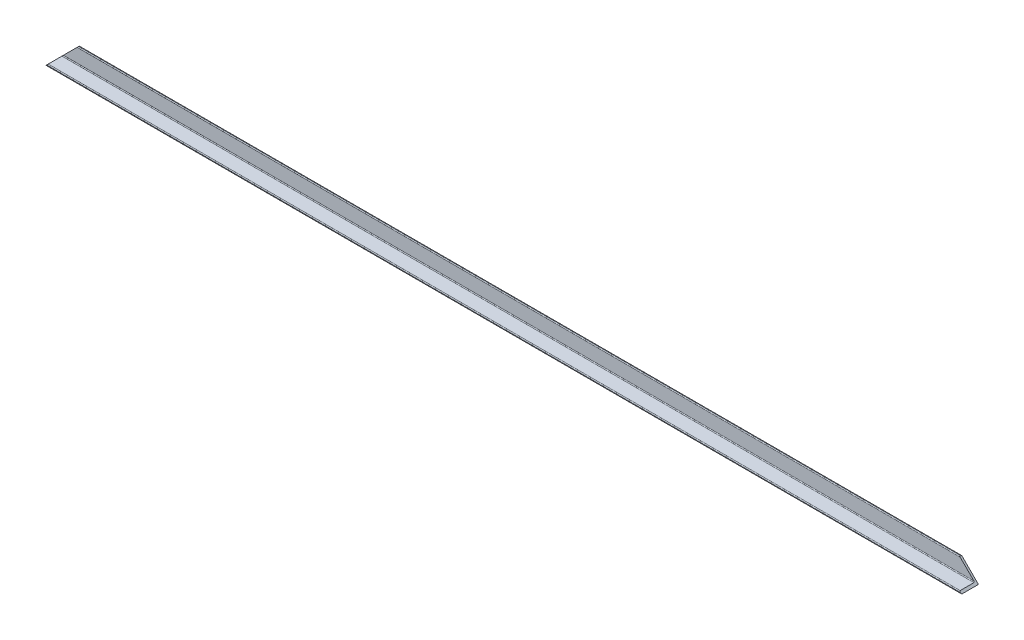
ISO-10303-21;
HEADER;
FILE_DESCRIPTION(('STEP AP214'),'2;1');
FILE_NAME('part.step','',(''),(''),'','','');
FILE_SCHEMA(('AUTOMOTIVE_DESIGN { 1 0 10303 214 1 1 1 1 }'));
ENDSEC;
DATA;
#1=APPLICATION_CONTEXT('core data for automotive mechanical design processes');
#2=APPLICATION_PROTOCOL_DEFINITION('international standard','automotive_design',2000,#1);
#3=PRODUCT_CONTEXT('',#1,'mechanical');
#4=PRODUCT('Part','Part','',(#3));
#5=PRODUCT_RELATED_PRODUCT_CATEGORY('part','',(#4));
#6=PRODUCT_DEFINITION_FORMATION('','',#4);
#7=PRODUCT_DEFINITION_CONTEXT('part definition',#1,'design');
#8=PRODUCT_DEFINITION('design','',#6,#7);
#9=PRODUCT_DEFINITION_SHAPE('','',#8);
#10=(LENGTH_UNIT() NAMED_UNIT(*) SI_UNIT(.MILLI.,.METRE.));
#11=(NAMED_UNIT(*) PLANE_ANGLE_UNIT() SI_UNIT($,.RADIAN.));
#12=(NAMED_UNIT(*) SI_UNIT($,.STERADIAN.) SOLID_ANGLE_UNIT());
#13=UNCERTAINTY_MEASURE_WITH_UNIT(LENGTH_MEASURE(1.E-05),#10,'distance_accuracy_value','');
#14=(GEOMETRIC_REPRESENTATION_CONTEXT(3) GLOBAL_UNCERTAINTY_ASSIGNED_CONTEXT((#13)) GLOBAL_UNIT_ASSIGNED_CONTEXT((#10,
#11,#12)) REPRESENTATION_CONTEXT('',''));
#15=CARTESIAN_POINT('',(0.,0.,0.));
#16=DIRECTION('',(0.,0.,1.));
#17=DIRECTION('',(1.,0.,0.));
#18=AXIS2_PLACEMENT_3D('',#15,#16,#17);
#19=CARTESIAN_POINT('',(-610.,2.5,-11.25));
#20=DIRECTION('',(0.,0.,1.));
#21=DIRECTION('',(1.,0.,0.));
#22=AXIS2_PLACEMENT_3D('',#19,#20,#21);
#23=PLANE('',#22);
#24=DIRECTION('',(-0.707106781186544,0.707106781186551,0.));
#25=VECTOR('',#24,1.);
#26=CARTESIAN_POINT('',(-4.99999999999357,607.5,-11.25));
#27=LINE('',#26,#25);
#28=CARTESIAN_POINT('',(601.5,0.99999999999989,-11.25));
#29=VERTEX_POINT('',#28);
#30=CARTESIAN_POINT('',(581.000000000001,21.4999999999999,-11.25));
#31=VERTEX_POINT('',#30);
#32=EDGE_CURVE('E126',#29,#31,#27,.T.);
#33=ORIENTED_EDGE('',*,*,#32,.F.);
#34=DIRECTION('',(-1.,0.,0.));
#35=VECTOR('',#34,1.);
#36=CARTESIAN_POINT('',(-610.,1.,-11.25));
#37=LINE('',#36,#35);
#38=CARTESIAN_POINT('',(-601.5,1.00000000000002,-11.25));
#39=VERTEX_POINT('',#38);
#40=EDGE_CURVE('E138',#29,#39,#37,.T.);
#41=ORIENTED_EDGE('',*,*,#40,.T.);
#42=DIRECTION('',(-0.707106781186544,-0.707106781186551,0.));
#43=VECTOR('',#42,1.);
#44=CARTESIAN_POINT('',(-605.,-2.49999999999995,-11.25));
#45=LINE('',#44,#43);
#46=CARTESIAN_POINT('',(-581.,21.5,-11.25));
#47=VERTEX_POINT('',#46);
#48=EDGE_CURVE('E221',#47,#39,#45,.T.);
#49=ORIENTED_EDGE('',*,*,#48,.F.);
#50=DIRECTION('',(-1.,0.,0.));
#51=VECTOR('',#50,1.);
#52=CARTESIAN_POINT('',(580.,21.5,-11.25));
#53=LINE('',#52,#51);
#54=EDGE_CURVE('E141',#47,#31,#53,.F.);
#55=ORIENTED_EDGE('',*,*,#54,.T.);
#56=EDGE_LOOP('',(#33,#41,#49,#55));
#57=FACE_BOUND('',#56,.T.);
#58=ADVANCED_FACE('F33',(#57),#23,.F.);
#59=CARTESIAN_POINT('',(-610.,2.5,11.25));
#60=DIRECTION('',(0.,0.,-1.));
#61=DIRECTION('',(-1.,0.,0.));
#62=AXIS2_PLACEMENT_3D('',#59,#60,#61);
#63=PLANE('',#62);
#64=DIRECTION('',(0.707106781186544,0.707106781186551,0.));
#65=VECTOR('',#64,1.);
#66=CARTESIAN_POINT('',(-610.,-7.5,11.25));
#67=LINE('',#66,#65);
#68=CARTESIAN_POINT('',(-601.5,1.00000000000002,11.25));
#69=VERTEX_POINT('',#68);
#70=CARTESIAN_POINT('',(-601.,1.49999999999999,11.25));
#71=VERTEX_POINT('',#70);
#72=EDGE_CURVE('E142',#69,#71,#67,.T.);
#73=ORIENTED_EDGE('',*,*,#72,.F.);
#74=DIRECTION('',(1.,0.,0.));
#75=VECTOR('',#74,1.);
#76=CARTESIAN_POINT('',(-610.,1.,11.25));
#77=LINE('',#76,#75);
#78=CARTESIAN_POINT('',(601.5,1.00000000000002,11.25));
#79=VERTEX_POINT('',#78);
#80=EDGE_CURVE('E171',#69,#79,#77,.T.);
#81=ORIENTED_EDGE('',*,*,#80,.T.);
#82=DIRECTION('',(0.707106781186544,-0.707106781186551,0.));
#83=VECTOR('',#82,1.);
#84=CARTESIAN_POINT('',(610.,-7.5,11.25));
#85=LINE('',#84,#83);
#86=CARTESIAN_POINT('',(601.,1.49999999999999,11.25));
#87=VERTEX_POINT('',#86);
#88=EDGE_CURVE('E234',#87,#79,#85,.T.);
#89=ORIENTED_EDGE('',*,*,#88,.F.);
#90=DIRECTION('',(1.,0.,0.));
#91=VECTOR('',#90,1.);
#92=CARTESIAN_POINT('',(-600.,1.5,11.25));
#93=LINE('',#92,#91);
#94=EDGE_CURVE('E133',#87,#71,#93,.F.);
#95=ORIENTED_EDGE('',*,*,#94,.T.);
#96=EDGE_LOOP('',(#73,#81,#89,#95));
#97=FACE_BOUND('',#96,.T.);
#98=ADVANCED_FACE('F241',(#97),#63,.F.);
#99=CARTESIAN_POINT('',(0.,2.5,0.));
#100=DIRECTION('',(0.,1.,0.));
#101=DIRECTION('',(0.,0.,1.));
#102=AXIS2_PLACEMENT_3D('',#99,#100,#101);
#103=PLANE('',#102);
#104=DIRECTION('',(0.,0.,1.));
#105=VECTOR('',#104,1.);
#106=CARTESIAN_POINT('',(-600.,2.5,0.));
#107=LINE('',#106,#105);
#108=CARTESIAN_POINT('',(-600.,2.5,-7.75));
#109=VERTEX_POINT('',#108);
#110=CARTESIAN_POINT('',(-600.,2.5,10.25));
#111=VERTEX_POINT('',#110);
#112=EDGE_CURVE('E209',#109,#111,#107,.T.);
#113=ORIENTED_EDGE('',*,*,#112,.T.);
#114=DIRECTION('',(1.,0.,0.));
#115=VECTOR('',#114,1.);
#116=CARTESIAN_POINT('',(600.,2.5,10.25));
#117=LINE('',#116,#115);
#118=CARTESIAN_POINT('',(600.,2.5,10.25));
#119=VERTEX_POINT('',#118);
#120=EDGE_CURVE('E175',#111,#119,#117,.T.);
#121=ORIENTED_EDGE('',*,*,#120,.T.);
#122=DIRECTION('',(0.,0.,-1.));
#123=VECTOR('',#122,1.);
#124=CARTESIAN_POINT('',(600.,2.5,0.));
#125=LINE('',#124,#123);
#126=CARTESIAN_POINT('',(600.,2.5,-7.75));
#127=VERTEX_POINT('',#126);
#128=EDGE_CURVE('E190',#119,#127,#125,.T.);
#129=ORIENTED_EDGE('',*,*,#128,.T.);
#130=DIRECTION('',(1.,0.,0.));
#131=VECTOR('',#130,1.);
#132=CARTESIAN_POINT('',(0.,2.5,-7.75));
#133=LINE('',#132,#131);
#134=EDGE_CURVE('E173',#127,#109,#133,.F.);
#135=ORIENTED_EDGE('',*,*,#134,.T.);
#136=EDGE_LOOP('',(#113,#121,#129,#135));
#137=FACE_BOUND('',#136,.T.);
#138=ADVANCED_FACE('F198',(#137),#103,.T.);
#139=CARTESIAN_POINT('',(0.,0.,0.));
#140=DIRECTION('',(0.,1.,0.));
#141=DIRECTION('',(0.,0.,1.));
#142=AXIS2_PLACEMENT_3D('',#139,#140,#141);
#143=PLANE('',#142);
#144=DIRECTION('',(0.,0.,1.));
#145=VECTOR('',#144,1.);
#146=CARTESIAN_POINT('',(-602.5,0.,0.));
#147=LINE('',#146,#145);
#148=CARTESIAN_POINT('',(-602.5,0.,-10.25));
#149=VERTEX_POINT('',#148);
#150=CARTESIAN_POINT('',(-602.5,0.,10.25));
#151=VERTEX_POINT('',#150);
#152=EDGE_CURVE('E214',#149,#151,#147,.T.);
#153=ORIENTED_EDGE('',*,*,#152,.F.);
#154=DIRECTION('',(-1.,0.,0.));
#155=VECTOR('',#154,1.);
#156=CARTESIAN_POINT('',(0.,0.,-10.25));
#157=LINE('',#156,#155);
#158=CARTESIAN_POINT('',(602.5,0.,-10.25));
#159=VERTEX_POINT('',#158);
#160=EDGE_CURVE('E162',#149,#159,#157,.F.);
#161=ORIENTED_EDGE('',*,*,#160,.T.);
#162=DIRECTION('',(0.,0.,-1.));
#163=VECTOR('',#162,1.);
#164=CARTESIAN_POINT('',(602.5,0.,0.));
#165=LINE('',#164,#163);
#166=CARTESIAN_POINT('',(602.5,0.,10.25));
#167=VERTEX_POINT('',#166);
#168=EDGE_CURVE('E129',#167,#159,#165,.T.);
#169=ORIENTED_EDGE('',*,*,#168,.F.);
#170=DIRECTION('',(1.,0.,0.));
#171=VECTOR('',#170,1.);
#172=CARTESIAN_POINT('',(0.,0.,10.25));
#173=LINE('',#172,#171);
#174=EDGE_CURVE('E160',#167,#151,#173,.F.);
#175=ORIENTED_EDGE('',*,*,#174,.T.);
#176=EDGE_LOOP('',(#153,#161,#169,#175));
#177=FACE_BOUND('',#176,.T.);
#178=ADVANCED_FACE('F249',(#177),#143,.F.);
#179=CARTESIAN_POINT('',(-610.,22.5,-8.75));
#180=DIRECTION('',(0.,0.,-1.));
#181=DIRECTION('',(-1.,0.,0.));
#182=AXIS2_PLACEMENT_3D('',#179,#180,#181);
#183=PLANE('',#182);
#184=DIRECTION('',(0.707106781186544,-0.707106781186551,0.));
#185=VECTOR('',#184,1.);
#186=CARTESIAN_POINT('',(-14.9999999999936,617.5,-8.75));
#187=LINE('',#186,#185);
#188=CARTESIAN_POINT('',(581.000000000001,21.4999999999999,-8.75));
#189=VERTEX_POINT('',#188);
#190=CARTESIAN_POINT('',(599.,3.49999999999995,-8.75));
#191=VERTEX_POINT('',#190);
#192=EDGE_CURVE('E192',#189,#191,#187,.T.);
#193=ORIENTED_EDGE('',*,*,#192,.F.);
#194=DIRECTION('',(1.,0.,0.));
#195=VECTOR('',#194,1.);
#196=CARTESIAN_POINT('',(-580.,21.5,-8.75));
#197=LINE('',#196,#195);
#198=CARTESIAN_POINT('',(-581.,21.5,-8.75));
#199=VERTEX_POINT('',#198);
#200=EDGE_CURVE('E187',#189,#199,#197,.F.);
#201=ORIENTED_EDGE('',*,*,#200,.T.);
#202=DIRECTION('',(0.707106781186544,0.707106781186551,0.));
#203=VECTOR('',#202,1.);
#204=CARTESIAN_POINT('',(-595.,7.50000000000015,-8.75));
#205=LINE('',#204,#203);
#206=CARTESIAN_POINT('',(-599.,3.5,-8.75));
#207=VERTEX_POINT('',#206);
#208=EDGE_CURVE('E207',#207,#199,#205,.T.);
#209=ORIENTED_EDGE('',*,*,#208,.F.);
#210=DIRECTION('',(1.,0.,0.));
#211=VECTOR('',#210,1.);
#212=CARTESIAN_POINT('',(-610.,3.5,-8.75));
#213=LINE('',#212,#211);
#214=EDGE_CURVE('E184',#207,#191,#213,.T.);
#215=ORIENTED_EDGE('',*,*,#214,.T.);
#216=EDGE_LOOP('',(#193,#201,#209,#215));
#217=FACE_BOUND('',#216,.T.);
#218=ADVANCED_FACE('F211',(#217),#183,.F.);
#219=CARTESIAN_POINT('',(0.,22.5,0.));
#220=DIRECTION('',(0.,1.,0.));
#221=DIRECTION('',(0.,0.,1.));
#222=AXIS2_PLACEMENT_3D('',#219,#220,#221);
#223=PLANE('',#222);
#224=DIRECTION('',(0.,0.,-1.));
#225=VECTOR('',#224,1.);
#226=CARTESIAN_POINT('',(580.,22.5,11.25));
#227=LINE('',#226,#225);
#228=CARTESIAN_POINT('',(580.,22.5,-9.75));
#229=VERTEX_POINT('',#228);
#230=CARTESIAN_POINT('',(580.,22.5,-10.25));
#231=VERTEX_POINT('',#230);
#232=EDGE_CURVE('E232',#229,#231,#227,.T.);
#233=ORIENTED_EDGE('',*,*,#232,.T.);
#234=DIRECTION('',(-1.,0.,0.));
#235=VECTOR('',#234,1.);
#236=CARTESIAN_POINT('',(-580.,22.5,-10.25));
#237=LINE('',#236,#235);
#238=CARTESIAN_POINT('',(-580.,22.5,-10.25));
#239=VERTEX_POINT('',#238);
#240=EDGE_CURVE('E181',#231,#239,#237,.T.);
#241=ORIENTED_EDGE('',*,*,#240,.T.);
#242=DIRECTION('',(0.,0.,1.));
#243=VECTOR('',#242,1.);
#244=CARTESIAN_POINT('',(-580.,22.5,0.));
#245=LINE('',#244,#243);
#246=CARTESIAN_POINT('',(-580.,22.5,-9.75));
#247=VERTEX_POINT('',#246);
#248=EDGE_CURVE('E150',#239,#247,#245,.T.);
#249=ORIENTED_EDGE('',*,*,#248,.T.);
#250=DIRECTION('',(1.,0.,0.));
#251=VECTOR('',#250,1.);
#252=CARTESIAN_POINT('',(580.,22.5,-9.75));
#253=LINE('',#252,#251);
#254=EDGE_CURVE('E178',#247,#229,#253,.T.);
#255=ORIENTED_EDGE('',*,*,#254,.T.);
#256=EDGE_LOOP('',(#233,#241,#249,#255));
#257=FACE_BOUND('',#256,.T.);
#258=ADVANCED_FACE('F227',(#257),#223,.T.);
#259=CARTESIAN_POINT('',(-610.,-7.5,11.25));
#260=DIRECTION('',(-0.707106781186551,0.707106781186544,0.));
#261=DIRECTION('',(-0.707106781186544,-0.707106781186551,0.));
#262=AXIS2_PLACEMENT_3D('',#259,#260,#261);
#263=PLANE('',#262);
#264=ORIENTED_EDGE('',*,*,#48,.T.);
#265=CARTESIAN_POINT('',(-601.5,1.,-10.25));
#266=DIRECTION('',(-0.707106781186551,0.707106781186544,0.));
#267=DIRECTION('',(-0.707106781186544,-0.707106781186551,0.));
#268=AXIS2_PLACEMENT_3D('',#265,#266,#267);
#269=ELLIPSE('',#268,1.41421356237309,1.);
#270=EDGE_CURVE('E145',#39,#149,#269,.T.);
#271=ORIENTED_EDGE('',*,*,#270,.T.);
#272=ORIENTED_EDGE('',*,*,#152,.T.);
#273=CARTESIAN_POINT('',(-601.5,1.,10.25));
#274=DIRECTION('',(-0.707106781186551,0.707106781186544,0.));
#275=DIRECTION('',(0.707106781186544,0.707106781186551,0.));
#276=AXIS2_PLACEMENT_3D('',#273,#274,#275);
#277=ELLIPSE('',#276,1.41421356237309,1.);
#278=EDGE_CURVE('E157',#151,#69,#277,.T.);
#279=ORIENTED_EDGE('',*,*,#278,.T.);
#280=ORIENTED_EDGE('',*,*,#72,.T.);
#281=CARTESIAN_POINT('',(-601.,1.5,10.25));
#282=DIRECTION('',(-0.707106781186551,0.707106781186544,0.));
#283=DIRECTION('',(-0.707106781186544,-0.707106781186551,0.));
#284=AXIS2_PLACEMENT_3D('',#281,#282,#283);
#285=ELLIPSE('',#284,1.41421356237309,1.);
#286=EDGE_CURVE('E155',#71,#111,#285,.T.);
#287=ORIENTED_EDGE('',*,*,#286,.T.);
#288=ORIENTED_EDGE('',*,*,#112,.F.);
#289=CARTESIAN_POINT('',(-599.,3.5,-7.75));
#290=DIRECTION('',(-0.707106781186551,0.707106781186544,0.));
#291=DIRECTION('',(0.707106781186544,0.707106781186551,0.));
#292=AXIS2_PLACEMENT_3D('',#289,#290,#291);
#293=ELLIPSE('',#292,1.41421356237309,1.);
#294=EDGE_CURVE('E11',#109,#207,#293,.F.);
#295=ORIENTED_EDGE('',*,*,#294,.T.);
#296=ORIENTED_EDGE('',*,*,#208,.T.);
#297=CARTESIAN_POINT('',(-581.,21.5,-9.75));
#298=DIRECTION('',(-0.707106781186551,0.707106781186544,0.));
#299=DIRECTION('',(-0.707106781186544,-0.707106781186551,0.));
#300=AXIS2_PLACEMENT_3D('',#297,#298,#299);
#301=ELLIPSE('',#300,1.41421356237309,1.);
#302=EDGE_CURVE('E146',#199,#247,#301,.T.);
#303=ORIENTED_EDGE('',*,*,#302,.T.);
#304=ORIENTED_EDGE('',*,*,#248,.F.);
#305=CARTESIAN_POINT('',(-581.,21.5,-10.25));
#306=DIRECTION('',(-0.707106781186551,0.707106781186544,0.));
#307=DIRECTION('',(0.707106781186544,0.707106781186551,0.));
#308=AXIS2_PLACEMENT_3D('',#305,#306,#307);
#309=ELLIPSE('',#308,1.41421356237309,1.);
#310=EDGE_CURVE('E148',#239,#47,#309,.T.);
#311=ORIENTED_EDGE('',*,*,#310,.T.);
#312=EDGE_LOOP('',(#264,#271,#272,#279,#280,#287,#288,#295,#296,#303,#304,#311));
#313=FACE_BOUND('',#312,.T.);
#314=ADVANCED_FACE('F206',(#313),#263,.T.);
#315=CARTESIAN_POINT('',(610.,-7.5,11.25));
#316=DIRECTION('',(0.707106781186551,0.707106781186544,0.));
#317=DIRECTION('',(-0.707106781186544,0.707106781186551,0.));
#318=AXIS2_PLACEMENT_3D('',#315,#316,#317);
#319=PLANE('',#318);
#320=ORIENTED_EDGE('',*,*,#168,.T.);
#321=CARTESIAN_POINT('',(601.5,1.,-10.25));
#322=DIRECTION('',(0.707106781186551,0.707106781186544,0.));
#323=DIRECTION('',(-0.707106781186544,0.707106781186551,0.));
#324=AXIS2_PLACEMENT_3D('',#321,#322,#323);
#325=ELLIPSE('',#324,1.41421356237309,1.);
#326=EDGE_CURVE('E123',#159,#29,#325,.T.);
#327=ORIENTED_EDGE('',*,*,#326,.T.);
#328=ORIENTED_EDGE('',*,*,#32,.T.);
#329=CARTESIAN_POINT('',(581.,21.5,-10.25));
#330=DIRECTION('',(0.707106781186551,0.707106781186544,0.));
#331=DIRECTION('',(0.707106781186544,-0.707106781186551,0.));
#332=AXIS2_PLACEMENT_3D('',#329,#330,#331);
#333=ELLIPSE('',#332,1.41421356237309,1.);
#334=EDGE_CURVE('E166',#31,#231,#333,.T.);
#335=ORIENTED_EDGE('',*,*,#334,.T.);
#336=ORIENTED_EDGE('',*,*,#232,.F.);
#337=CARTESIAN_POINT('',(581.,21.5,-9.75));
#338=DIRECTION('',(0.707106781186551,0.707106781186544,0.));
#339=DIRECTION('',(-0.707106781186544,0.707106781186551,0.));
#340=AXIS2_PLACEMENT_3D('',#337,#338,#339);
#341=ELLIPSE('',#340,1.41421356237309,1.);
#342=EDGE_CURVE('E164',#229,#189,#341,.T.);
#343=ORIENTED_EDGE('',*,*,#342,.T.);
#344=ORIENTED_EDGE('',*,*,#192,.T.);
#345=CARTESIAN_POINT('',(599.,3.5,-7.75));
#346=DIRECTION('',(0.707106781186551,0.707106781186544,0.));
#347=DIRECTION('',(0.707106781186544,-0.707106781186551,0.));
#348=AXIS2_PLACEMENT_3D('',#345,#346,#347);
#349=ELLIPSE('',#348,1.41421356237309,1.);
#350=EDGE_CURVE('E41',#191,#127,#349,.F.);
#351=ORIENTED_EDGE('',*,*,#350,.T.);
#352=ORIENTED_EDGE('',*,*,#128,.F.);
#353=CARTESIAN_POINT('',(601.,1.5,10.25));
#354=DIRECTION('',(0.707106781186551,0.707106781186544,0.));
#355=DIRECTION('',(-0.707106781186544,0.707106781186551,0.));
#356=AXIS2_PLACEMENT_3D('',#353,#354,#355);
#357=ELLIPSE('',#356,1.41421356237309,1.);
#358=EDGE_CURVE('E56',#119,#87,#357,.T.);
#359=ORIENTED_EDGE('',*,*,#358,.T.);
#360=ORIENTED_EDGE('',*,*,#88,.T.);
#361=CARTESIAN_POINT('',(601.5,1.,10.25));
#362=DIRECTION('',(0.707106781186551,0.707106781186544,0.));
#363=DIRECTION('',(0.707106781186544,-0.707106781186551,0.));
#364=AXIS2_PLACEMENT_3D('',#361,#362,#363);
#365=ELLIPSE('',#364,1.41421356237309,1.);
#366=EDGE_CURVE('E48',#79,#167,#365,.T.);
#367=ORIENTED_EDGE('',*,*,#366,.T.);
#368=EDGE_LOOP('',(#320,#327,#328,#335,#336,#343,#344,#351,#352,#359,#360,#367));
#369=FACE_BOUND('',#368,.T.);
#370=ADVANCED_FACE('F125',(#369),#319,.T.);
#371=CARTESIAN_POINT('',(-610.,1.,-10.25));
#372=DIRECTION('',(-1.,0.,0.));
#373=DIRECTION('',(0.,0.,1.));
#374=AXIS2_PLACEMENT_3D('',#371,#372,#373);
#375=CYLINDRICAL_SURFACE('',#374,1.);
#376=ORIENTED_EDGE('',*,*,#326,.F.);
#377=ORIENTED_EDGE('',*,*,#160,.F.);
#378=ORIENTED_EDGE('',*,*,#270,.F.);
#379=ORIENTED_EDGE('',*,*,#40,.F.);
#380=EDGE_LOOP('',(#376,#377,#378,#379));
#381=FACE_BOUND('',#380,.T.);
#382=ADVANCED_FACE('F144',(#381),#375,.T.);
#383=CARTESIAN_POINT('',(-610.,1.,10.25));
#384=DIRECTION('',(1.,0.,0.));
#385=DIRECTION('',(0.,0.,-1.));
#386=AXIS2_PLACEMENT_3D('',#383,#384,#385);
#387=CYLINDRICAL_SURFACE('',#386,1.);
#388=ORIENTED_EDGE('',*,*,#278,.F.);
#389=ORIENTED_EDGE('',*,*,#174,.F.);
#390=ORIENTED_EDGE('',*,*,#366,.F.);
#391=ORIENTED_EDGE('',*,*,#80,.F.);
#392=EDGE_LOOP('',(#388,#389,#390,#391));
#393=FACE_BOUND('',#392,.T.);
#394=ADVANCED_FACE('F246',(#393),#387,.T.);
#395=CARTESIAN_POINT('',(0.,1.5,10.25));
#396=DIRECTION('',(-1.,0.,0.));
#397=DIRECTION('',(0.,0.,1.));
#398=AXIS2_PLACEMENT_3D('',#395,#396,#397);
#399=CYLINDRICAL_SURFACE('',#398,1.);
#400=ORIENTED_EDGE('',*,*,#286,.F.);
#401=ORIENTED_EDGE('',*,*,#94,.F.);
#402=ORIENTED_EDGE('',*,*,#358,.F.);
#403=ORIENTED_EDGE('',*,*,#120,.F.);
#404=EDGE_LOOP('',(#400,#401,#402,#403));
#405=FACE_BOUND('',#404,.T.);
#406=ADVANCED_FACE('F244',(#405),#399,.T.);
#407=CARTESIAN_POINT('',(0.,21.5,-10.25));
#408=DIRECTION('',(1.,0.,0.));
#409=DIRECTION('',(0.,0.,-1.));
#410=AXIS2_PLACEMENT_3D('',#407,#408,#409);
#411=CYLINDRICAL_SURFACE('',#410,1.);
#412=ORIENTED_EDGE('',*,*,#334,.F.);
#413=ORIENTED_EDGE('',*,*,#54,.F.);
#414=ORIENTED_EDGE('',*,*,#310,.F.);
#415=ORIENTED_EDGE('',*,*,#240,.F.);
#416=EDGE_LOOP('',(#412,#413,#414,#415));
#417=FACE_BOUND('',#416,.T.);
#418=ADVANCED_FACE('F251',(#417),#411,.T.);
#419=CARTESIAN_POINT('',(0.,21.5,-9.75));
#420=DIRECTION('',(-1.,0.,0.));
#421=DIRECTION('',(0.,0.,1.));
#422=AXIS2_PLACEMENT_3D('',#419,#420,#421);
#423=CYLINDRICAL_SURFACE('',#422,1.);
#424=ORIENTED_EDGE('',*,*,#302,.F.);
#425=ORIENTED_EDGE('',*,*,#200,.F.);
#426=ORIENTED_EDGE('',*,*,#342,.F.);
#427=ORIENTED_EDGE('',*,*,#254,.F.);
#428=EDGE_LOOP('',(#424,#425,#426,#427));
#429=FACE_BOUND('',#428,.T.);
#430=ADVANCED_FACE('F231',(#429),#423,.T.);
#431=CARTESIAN_POINT('',(-610.,3.5,-7.75));
#432=DIRECTION('',(1.,0.,0.));
#433=DIRECTION('',(0.,0.,-1.));
#434=AXIS2_PLACEMENT_3D('',#431,#432,#433);
#435=CYLINDRICAL_SURFACE('',#434,1.);
#436=ORIENTED_EDGE('',*,*,#294,.F.);
#437=ORIENTED_EDGE('',*,*,#134,.F.);
#438=ORIENTED_EDGE('',*,*,#350,.F.);
#439=ORIENTED_EDGE('',*,*,#214,.F.);
#440=EDGE_LOOP('',(#436,#437,#438,#439));
#441=FACE_BOUND('',#440,.T.);
#442=ADVANCED_FACE('F35',(#441),#435,.F.);
#443=CLOSED_SHELL('',(#58,#98,#138,#178,#218,#258,#314,#370,#382,#394,#406,#418,#430,#442));
#444=MANIFOLD_SOLID_BREP('B2',#443);
#445=ADVANCED_BREP_SHAPE_REPRESENTATION('',(#18,#444),#14);
#446=SHAPE_DEFINITION_REPRESENTATION(#9,#445);
ENDSEC;
END-ISO-10303-21;
